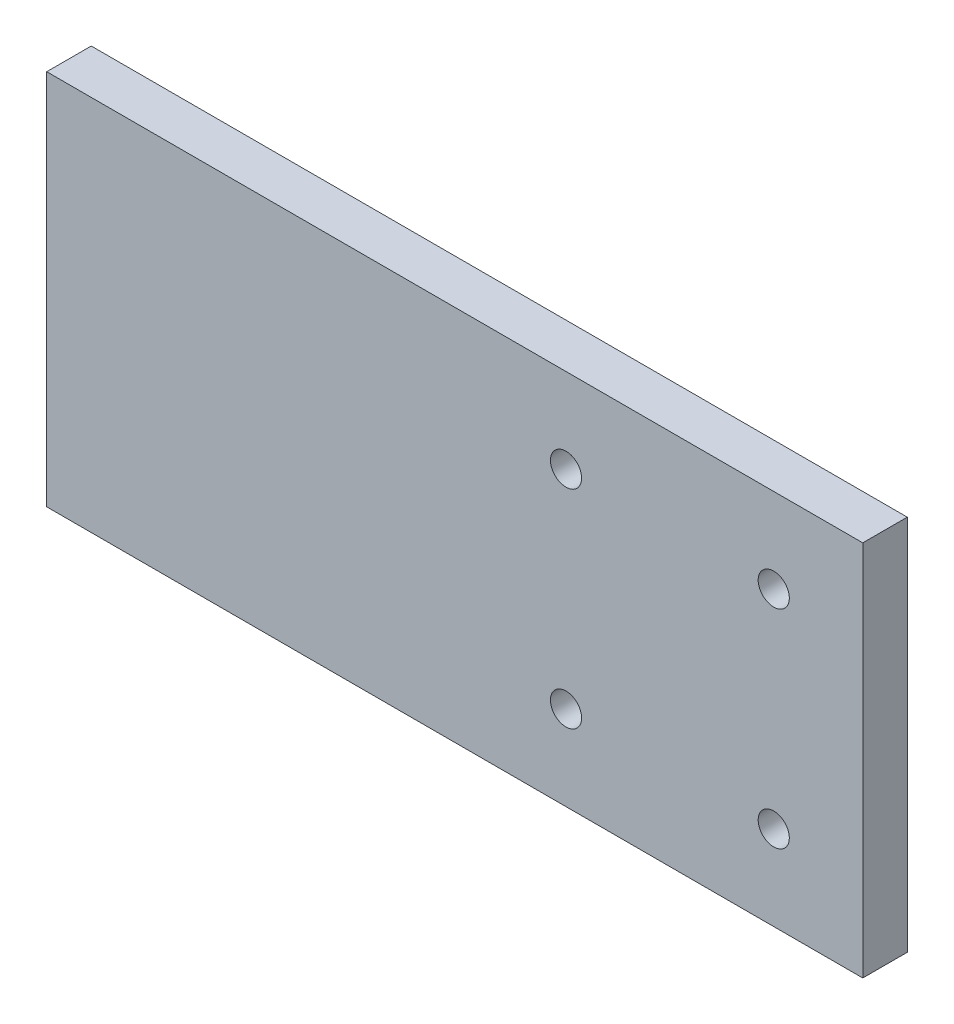
ISO-10303-21;
HEADER;
FILE_DESCRIPTION(('STEP AP214'),'2;1');
FILE_NAME('part.step','',(''),(''),'','','');
FILE_SCHEMA(('AUTOMOTIVE_DESIGN { 1 0 10303 214 1 1 1 1 }'));
ENDSEC;
DATA;
#1=APPLICATION_CONTEXT('core data for automotive mechanical design processes');
#2=APPLICATION_PROTOCOL_DEFINITION('international standard','automotive_design',2000,#1);
#3=PRODUCT_CONTEXT('',#1,'mechanical');
#4=PRODUCT('Part','Part','',(#3));
#5=PRODUCT_RELATED_PRODUCT_CATEGORY('part','',(#4));
#6=PRODUCT_DEFINITION_FORMATION('','',#4);
#7=PRODUCT_DEFINITION_CONTEXT('part definition',#1,'design');
#8=PRODUCT_DEFINITION('design','',#6,#7);
#9=PRODUCT_DEFINITION_SHAPE('','',#8);
#10=(LENGTH_UNIT() NAMED_UNIT(*) SI_UNIT(.MILLI.,.METRE.));
#11=(NAMED_UNIT(*) PLANE_ANGLE_UNIT() SI_UNIT($,.RADIAN.));
#12=(NAMED_UNIT(*) SI_UNIT($,.STERADIAN.) SOLID_ANGLE_UNIT());
#13=UNCERTAINTY_MEASURE_WITH_UNIT(LENGTH_MEASURE(1.E-05),#10,'distance_accuracy_value','');
#14=(GEOMETRIC_REPRESENTATION_CONTEXT(3) GLOBAL_UNCERTAINTY_ASSIGNED_CONTEXT((#13)) GLOBAL_UNIT_ASSIGNED_CONTEXT((#10,
#11,#12)) REPRESENTATION_CONTEXT('',''));
#15=CARTESIAN_POINT('',(0.,0.,0.));
#16=DIRECTION('',(0.,0.,1.));
#17=DIRECTION('',(1.,0.,0.));
#18=AXIS2_PLACEMENT_3D('',#15,#16,#17);
#19=CARTESIAN_POINT('',(0.,0.,6.));
#20=DIRECTION('',(0.,0.,-1.));
#21=DIRECTION('',(-1.,0.,0.));
#22=AXIS2_PLACEMENT_3D('',#19,#20,#21);
#23=PLANE('',#22);
#24=DIRECTION('',(0.,-1.,0.));
#25=VECTOR('',#24,1.);
#26=CARTESIAN_POINT('',(0.,0.,6.));
#27=LINE('',#26,#25);
#28=CARTESIAN_POINT('',(0.,50.8,6.));
#29=VERTEX_POINT('',#28);
#30=CARTESIAN_POINT('',(0.,0.,6.));
#31=VERTEX_POINT('',#30);
#32=EDGE_CURVE('E85',#29,#31,#27,.T.);
#33=ORIENTED_EDGE('',*,*,#32,.T.);
#34=DIRECTION('',(1.,0.,0.));
#35=VECTOR('',#34,1.);
#36=CARTESIAN_POINT('',(0.,0.,6.));
#37=LINE('',#36,#35);
#38=CARTESIAN_POINT('',(110.,0.,6.));
#39=VERTEX_POINT('',#38);
#40=EDGE_CURVE('E80',#31,#39,#37,.T.);
#41=ORIENTED_EDGE('',*,*,#40,.T.);
#42=DIRECTION('',(0.,1.,0.));
#43=VECTOR('',#42,1.);
#44=CARTESIAN_POINT('',(110.,0.,6.));
#45=LINE('',#44,#43);
#46=CARTESIAN_POINT('',(110.,50.8,6.));
#47=VERTEX_POINT('',#46);
#48=EDGE_CURVE('E83',#39,#47,#45,.T.);
#49=ORIENTED_EDGE('',*,*,#48,.T.);
#50=DIRECTION('',(-1.,0.,0.));
#51=VECTOR('',#50,1.);
#52=CARTESIAN_POINT('',(0.,50.8,6.));
#53=LINE('',#52,#51);
#54=EDGE_CURVE('E50',#47,#29,#53,.T.);
#55=ORIENTED_EDGE('',*,*,#54,.T.);
#56=EDGE_LOOP('',(#33,#41,#49,#55));
#57=FACE_BOUND('',#56,.T.);
#58=CARTESIAN_POINT('',(98.,39.4,6.));
#59=DIRECTION('',(0.,0.,1.));
#60=DIRECTION('',(1.,0.,0.));
#61=AXIS2_PLACEMENT_3D('',#58,#59,#60);
#62=CIRCLE('',#61,2.1);
#63=CARTESIAN_POINT('',(100.1,39.4,6.));
#64=VERTEX_POINT('',#63);
#65=EDGE_CURVE('E100',#64,#64,#62,.T.);
#66=ORIENTED_EDGE('',*,*,#65,.F.);
#67=EDGE_LOOP('',(#66));
#68=FACE_BOUND('',#67,.T.);
#69=CARTESIAN_POINT('',(98.,11.4,6.));
#70=DIRECTION('',(0.,0.,1.));
#71=DIRECTION('',(1.,0.,0.));
#72=AXIS2_PLACEMENT_3D('',#69,#70,#71);
#73=CIRCLE('',#72,2.1);
#74=CARTESIAN_POINT('',(100.1,11.4,6.));
#75=VERTEX_POINT('',#74);
#76=EDGE_CURVE('E115',#75,#75,#73,.T.);
#77=ORIENTED_EDGE('',*,*,#76,.F.);
#78=EDGE_LOOP('',(#77));
#79=FACE_BOUND('',#78,.T.);
#80=CARTESIAN_POINT('',(70.,11.4,6.));
#81=DIRECTION('',(0.,0.,1.));
#82=DIRECTION('',(1.,0.,0.));
#83=AXIS2_PLACEMENT_3D('',#80,#81,#82);
#84=CIRCLE('',#83,2.1);
#85=CARTESIAN_POINT('',(72.1,11.4,6.));
#86=VERTEX_POINT('',#85);
#87=EDGE_CURVE('E121',#86,#86,#84,.T.);
#88=ORIENTED_EDGE('',*,*,#87,.F.);
#89=EDGE_LOOP('',(#88));
#90=FACE_BOUND('',#89,.T.);
#91=CARTESIAN_POINT('',(70.,39.4,6.));
#92=DIRECTION('',(0.,0.,1.));
#93=DIRECTION('',(1.,0.,0.));
#94=AXIS2_PLACEMENT_3D('',#91,#92,#93);
#95=CIRCLE('',#94,2.1);
#96=CARTESIAN_POINT('',(72.1,39.4,6.));
#97=VERTEX_POINT('',#96);
#98=EDGE_CURVE('E127',#97,#97,#95,.T.);
#99=ORIENTED_EDGE('',*,*,#98,.F.);
#100=EDGE_LOOP('',(#99));
#101=FACE_BOUND('',#100,.T.);
#102=ADVANCED_FACE('F33',(#57,#68,#79,#90,#101),#23,.F.);
#103=CARTESIAN_POINT('',(0.,0.,0.));
#104=DIRECTION('',(0.,0.,-1.));
#105=DIRECTION('',(-1.,0.,0.));
#106=AXIS2_PLACEMENT_3D('',#103,#104,#105);
#107=PLANE('',#106);
#108=CARTESIAN_POINT('',(70.,11.4,0.));
#109=DIRECTION('',(0.,0.,1.));
#110=DIRECTION('',(1.,0.,0.));
#111=AXIS2_PLACEMENT_3D('',#108,#109,#110);
#112=CIRCLE('',#111,2.1);
#113=CARTESIAN_POINT('',(72.1,11.4,0.));
#114=VERTEX_POINT('',#113);
#115=EDGE_CURVE('E124',#114,#114,#112,.T.);
#116=ORIENTED_EDGE('',*,*,#115,.T.);
#117=EDGE_LOOP('',(#116));
#118=FACE_BOUND('',#117,.T.);
#119=CARTESIAN_POINT('',(98.,39.4,0.));
#120=DIRECTION('',(0.,0.,1.));
#121=DIRECTION('',(1.,0.,0.));
#122=AXIS2_PLACEMENT_3D('',#119,#120,#121);
#123=CIRCLE('',#122,2.1);
#124=CARTESIAN_POINT('',(100.1,39.4,0.));
#125=VERTEX_POINT('',#124);
#126=EDGE_CURVE('E112',#125,#125,#123,.T.);
#127=ORIENTED_EDGE('',*,*,#126,.T.);
#128=EDGE_LOOP('',(#127));
#129=FACE_BOUND('',#128,.T.);
#130=DIRECTION('',(0.,-1.,0.));
#131=VECTOR('',#130,1.);
#132=CARTESIAN_POINT('',(0.,0.,0.));
#133=LINE('',#132,#131);
#134=CARTESIAN_POINT('',(0.,50.8,0.));
#135=VERTEX_POINT('',#134);
#136=CARTESIAN_POINT('',(0.,0.,0.));
#137=VERTEX_POINT('',#136);
#138=EDGE_CURVE('E97',#135,#137,#133,.T.);
#139=ORIENTED_EDGE('',*,*,#138,.F.);
#140=DIRECTION('',(-1.,0.,0.));
#141=VECTOR('',#140,1.);
#142=CARTESIAN_POINT('',(0.,50.8,0.));
#143=LINE('',#142,#141);
#144=CARTESIAN_POINT('',(110.,50.8,0.));
#145=VERTEX_POINT('',#144);
#146=EDGE_CURVE('E73',#145,#135,#143,.T.);
#147=ORIENTED_EDGE('',*,*,#146,.F.);
#148=DIRECTION('',(0.,1.,0.));
#149=VECTOR('',#148,1.);
#150=CARTESIAN_POINT('',(110.,0.,0.));
#151=LINE('',#150,#149);
#152=CARTESIAN_POINT('',(110.,0.,0.));
#153=VERTEX_POINT('',#152);
#154=EDGE_CURVE('E67',#153,#145,#151,.T.);
#155=ORIENTED_EDGE('',*,*,#154,.F.);
#156=DIRECTION('',(1.,0.,0.));
#157=VECTOR('',#156,1.);
#158=CARTESIAN_POINT('',(0.,0.,0.));
#159=LINE('',#158,#157);
#160=EDGE_CURVE('E89',#137,#153,#159,.T.);
#161=ORIENTED_EDGE('',*,*,#160,.F.);
#162=EDGE_LOOP('',(#139,#147,#155,#161));
#163=FACE_BOUND('',#162,.T.);
#164=CARTESIAN_POINT('',(98.,11.4,0.));
#165=DIRECTION('',(0.,0.,1.));
#166=DIRECTION('',(1.,0.,0.));
#167=AXIS2_PLACEMENT_3D('',#164,#165,#166);
#168=CIRCLE('',#167,2.1);
#169=CARTESIAN_POINT('',(100.1,11.4,0.));
#170=VERTEX_POINT('',#169);
#171=EDGE_CURVE('E118',#170,#170,#168,.T.);
#172=ORIENTED_EDGE('',*,*,#171,.T.);
#173=EDGE_LOOP('',(#172));
#174=FACE_BOUND('',#173,.T.);
#175=CARTESIAN_POINT('',(70.,39.4,0.));
#176=DIRECTION('',(0.,0.,1.));
#177=DIRECTION('',(1.,0.,0.));
#178=AXIS2_PLACEMENT_3D('',#175,#176,#177);
#179=CIRCLE('',#178,2.1);
#180=CARTESIAN_POINT('',(72.1,39.4,0.));
#181=VERTEX_POINT('',#180);
#182=EDGE_CURVE('E130',#181,#181,#179,.T.);
#183=ORIENTED_EDGE('',*,*,#182,.T.);
#184=EDGE_LOOP('',(#183));
#185=FACE_BOUND('',#184,.T.);
#186=ADVANCED_FACE('F108',(#118,#129,#163,#174,#185),#107,.T.);
#187=CARTESIAN_POINT('',(0.,0.,6.));
#188=DIRECTION('',(1.,0.,0.));
#189=DIRECTION('',(0.,0.,-1.));
#190=AXIS2_PLACEMENT_3D('',#187,#188,#189);
#191=PLANE('',#190);
#192=ORIENTED_EDGE('',*,*,#138,.T.);
#193=DIRECTION('',(0.,0.,-1.));
#194=VECTOR('',#193,1.);
#195=CARTESIAN_POINT('',(0.,0.,6.));
#196=LINE('',#195,#194);
#197=EDGE_CURVE('E11',#31,#137,#196,.T.);
#198=ORIENTED_EDGE('',*,*,#197,.F.);
#199=ORIENTED_EDGE('',*,*,#32,.F.);
#200=DIRECTION('',(0.,0.,-1.));
#201=VECTOR('',#200,1.);
#202=CARTESIAN_POINT('',(0.,50.8,6.));
#203=LINE('',#202,#201);
#204=EDGE_CURVE('E93',#29,#135,#203,.T.);
#205=ORIENTED_EDGE('',*,*,#204,.T.);
#206=EDGE_LOOP('',(#192,#198,#199,#205));
#207=FACE_BOUND('',#206,.T.);
#208=ADVANCED_FACE('F35',(#207),#191,.F.);
#209=CARTESIAN_POINT('',(0.,0.,6.));
#210=DIRECTION('',(0.,1.,0.));
#211=DIRECTION('',(0.,0.,1.));
#212=AXIS2_PLACEMENT_3D('',#209,#210,#211);
#213=PLANE('',#212);
#214=ORIENTED_EDGE('',*,*,#160,.T.);
#215=DIRECTION('',(0.,0.,-1.));
#216=VECTOR('',#215,1.);
#217=CARTESIAN_POINT('',(110.,0.,6.));
#218=LINE('',#217,#216);
#219=EDGE_CURVE('E42',#39,#153,#218,.T.);
#220=ORIENTED_EDGE('',*,*,#219,.F.);
#221=ORIENTED_EDGE('',*,*,#40,.F.);
#222=ORIENTED_EDGE('',*,*,#197,.T.);
#223=EDGE_LOOP('',(#214,#220,#221,#222));
#224=FACE_BOUND('',#223,.T.);
#225=ADVANCED_FACE('F88',(#224),#213,.F.);
#226=CARTESIAN_POINT('',(110.,0.,6.));
#227=DIRECTION('',(-1.,0.,0.));
#228=DIRECTION('',(0.,0.,1.));
#229=AXIS2_PLACEMENT_3D('',#226,#227,#228);
#230=PLANE('',#229);
#231=ORIENTED_EDGE('',*,*,#154,.T.);
#232=DIRECTION('',(0.,0.,-1.));
#233=VECTOR('',#232,1.);
#234=CARTESIAN_POINT('',(110.,50.8,6.));
#235=LINE('',#234,#233);
#236=EDGE_CURVE('E90',#47,#145,#235,.T.);
#237=ORIENTED_EDGE('',*,*,#236,.F.);
#238=ORIENTED_EDGE('',*,*,#48,.F.);
#239=ORIENTED_EDGE('',*,*,#219,.T.);
#240=EDGE_LOOP('',(#231,#237,#238,#239));
#241=FACE_BOUND('',#240,.T.);
#242=ADVANCED_FACE('F91',(#241),#230,.F.);
#243=CARTESIAN_POINT('',(0.,50.8,6.));
#244=DIRECTION('',(0.,-1.,0.));
#245=DIRECTION('',(0.,0.,-1.));
#246=AXIS2_PLACEMENT_3D('',#243,#244,#245);
#247=PLANE('',#246);
#248=ORIENTED_EDGE('',*,*,#146,.T.);
#249=ORIENTED_EDGE('',*,*,#204,.F.);
#250=ORIENTED_EDGE('',*,*,#54,.F.);
#251=ORIENTED_EDGE('',*,*,#236,.T.);
#252=EDGE_LOOP('',(#248,#249,#250,#251));
#253=FACE_BOUND('',#252,.T.);
#254=ADVANCED_FACE('F105',(#253),#247,.F.);
#255=CARTESIAN_POINT('',(98.,39.4,6.));
#256=DIRECTION('',(0.,0.,-1.));
#257=DIRECTION('',(-1.,0.,0.));
#258=AXIS2_PLACEMENT_3D('',#255,#256,#257);
#259=CYLINDRICAL_SURFACE('',#258,2.1);
#260=ORIENTED_EDGE('',*,*,#65,.T.);
#261=EDGE_LOOP('',(#260));
#262=FACE_BOUND('',#261,.T.);
#263=ORIENTED_EDGE('',*,*,#126,.F.);
#264=EDGE_LOOP('',(#263));
#265=FACE_BOUND('',#264,.T.);
#266=ADVANCED_FACE('F147',(#262,#265),#259,.F.);
#267=CARTESIAN_POINT('',(98.,11.4,6.));
#268=DIRECTION('',(0.,0.,-1.));
#269=DIRECTION('',(-1.,0.,0.));
#270=AXIS2_PLACEMENT_3D('',#267,#268,#269);
#271=CYLINDRICAL_SURFACE('',#270,2.1);
#272=ORIENTED_EDGE('',*,*,#76,.T.);
#273=EDGE_LOOP('',(#272));
#274=FACE_BOUND('',#273,.T.);
#275=ORIENTED_EDGE('',*,*,#171,.F.);
#276=EDGE_LOOP('',(#275));
#277=FACE_BOUND('',#276,.T.);
#278=ADVANCED_FACE('F193',(#274,#277),#271,.F.);
#279=CARTESIAN_POINT('',(70.,11.4,6.));
#280=DIRECTION('',(0.,0.,-1.));
#281=DIRECTION('',(-1.,0.,0.));
#282=AXIS2_PLACEMENT_3D('',#279,#280,#281);
#283=CYLINDRICAL_SURFACE('',#282,2.1);
#284=ORIENTED_EDGE('',*,*,#87,.T.);
#285=EDGE_LOOP('',(#284));
#286=FACE_BOUND('',#285,.T.);
#287=ORIENTED_EDGE('',*,*,#115,.F.);
#288=EDGE_LOOP('',(#287));
#289=FACE_BOUND('',#288,.T.);
#290=ADVANCED_FACE('F201',(#286,#289),#283,.F.);
#291=CARTESIAN_POINT('',(70.,39.4,6.));
#292=DIRECTION('',(0.,0.,-1.));
#293=DIRECTION('',(-1.,0.,0.));
#294=AXIS2_PLACEMENT_3D('',#291,#292,#293);
#295=CYLINDRICAL_SURFACE('',#294,2.1);
#296=ORIENTED_EDGE('',*,*,#98,.T.);
#297=EDGE_LOOP('',(#296));
#298=FACE_BOUND('',#297,.T.);
#299=ORIENTED_EDGE('',*,*,#182,.F.);
#300=EDGE_LOOP('',(#299));
#301=FACE_BOUND('',#300,.T.);
#302=ADVANCED_FACE('F136',(#298,#301),#295,.F.);
#303=CLOSED_SHELL('',(#102,#186,#208,#225,#242,#254,#266,#278,#290,#302));
#304=MANIFOLD_SOLID_BREP('B2',#303);
#305=ADVANCED_BREP_SHAPE_REPRESENTATION('',(#18,#304),#14);
#306=SHAPE_DEFINITION_REPRESENTATION(#9,#305);
ENDSEC;
END-ISO-10303-21;
